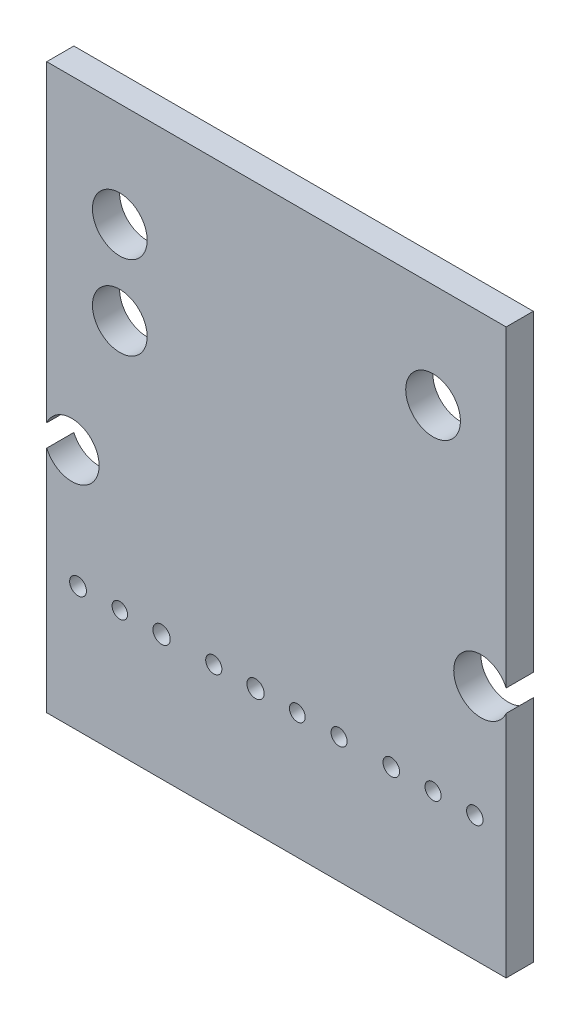
ISO-10303-21;
HEADER;
FILE_DESCRIPTION(('STEP AP214'),'2;1');
FILE_NAME('part.step','',(''),(''),'','','');
FILE_SCHEMA(('AUTOMOTIVE_DESIGN { 1 0 10303 214 1 1 1 1 }'));
ENDSEC;
DATA;
#1=APPLICATION_CONTEXT('core data for automotive mechanical design processes');
#2=APPLICATION_PROTOCOL_DEFINITION('international standard','automotive_design',2000,#1);
#3=PRODUCT_CONTEXT('',#1,'mechanical');
#4=PRODUCT('Part','Part','',(#3));
#5=PRODUCT_RELATED_PRODUCT_CATEGORY('part','',(#4));
#6=PRODUCT_DEFINITION_FORMATION('','',#4);
#7=PRODUCT_DEFINITION_CONTEXT('part definition',#1,'design');
#8=PRODUCT_DEFINITION('design','',#6,#7);
#9=PRODUCT_DEFINITION_SHAPE('','',#8);
#10=(LENGTH_UNIT() NAMED_UNIT(*) SI_UNIT(.MILLI.,.METRE.));
#11=(NAMED_UNIT(*) PLANE_ANGLE_UNIT() SI_UNIT($,.RADIAN.));
#12=(NAMED_UNIT(*) SI_UNIT($,.STERADIAN.) SOLID_ANGLE_UNIT());
#13=UNCERTAINTY_MEASURE_WITH_UNIT(LENGTH_MEASURE(1.E-05),#10,'distance_accuracy_value','');
#14=(GEOMETRIC_REPRESENTATION_CONTEXT(3) GLOBAL_UNCERTAINTY_ASSIGNED_CONTEXT((#13)) GLOBAL_UNIT_ASSIGNED_CONTEXT((#10,
#11,#12)) REPRESENTATION_CONTEXT('',''));
#15=CARTESIAN_POINT('',(0.,0.,0.));
#16=DIRECTION('',(0.,0.,1.));
#17=DIRECTION('',(1.,0.,0.));
#18=AXIS2_PLACEMENT_3D('',#15,#16,#17);
#19=CARTESIAN_POINT('',(26.416,14.605,1.651));
#20=DIRECTION('',(0.,0.,1.));
#21=DIRECTION('',(1.,0.,0.));
#22=AXIS2_PLACEMENT_3D('',#19,#20,#21);
#23=PLANE('',#22);
#24=CARTESIAN_POINT('',(23.495,7.62,1.651));
#25=DIRECTION('',(0.,0.,1.));
#26=DIRECTION('',(1.,0.,0.));
#27=AXIS2_PLACEMENT_3D('',#24,#25,#26);
#28=CIRCLE('',#27,0.490154405860465);
#29=CARTESIAN_POINT('',(23.9851544058605,7.62,1.651));
#30=VERTEX_POINT('',#29);
#31=EDGE_CURVE('E241',#30,#30,#28,.T.);
#32=ORIENTED_EDGE('',*,*,#31,.F.);
#33=EDGE_LOOP('',(#32));
#34=FACE_BOUND('',#33,.T.);
#35=CARTESIAN_POINT('',(17.78,7.62,1.651));
#36=DIRECTION('',(0.,0.,1.));
#37=DIRECTION('',(1.,0.,0.));
#38=AXIS2_PLACEMENT_3D('',#35,#36,#37);
#39=CIRCLE('',#38,0.488742188507494);
#40=CARTESIAN_POINT('',(18.2687421885075,7.62,1.651));
#41=VERTEX_POINT('',#40);
#42=EDGE_CURVE('E229',#41,#41,#39,.T.);
#43=ORIENTED_EDGE('',*,*,#42,.F.);
#44=EDGE_LOOP('',(#43));
#45=FACE_BOUND('',#44,.T.);
#46=CARTESIAN_POINT('',(12.7,7.62,1.651));
#47=DIRECTION('',(0.,0.,1.));
#48=DIRECTION('',(1.,0.,0.));
#49=AXIS2_PLACEMENT_3D('',#46,#47,#48);
#50=CIRCLE('',#49,0.523724162190865);
#51=CARTESIAN_POINT('',(13.2237241621909,7.62,1.651));
#52=VERTEX_POINT('',#51);
#53=EDGE_CURVE('E217',#52,#52,#50,.T.);
#54=ORIENTED_EDGE('',*,*,#53,.F.);
#55=EDGE_LOOP('',(#54));
#56=FACE_BOUND('',#55,.T.);
#57=CARTESIAN_POINT('',(6.985,7.62,1.651));
#58=DIRECTION('',(0.,0.,1.));
#59=DIRECTION('',(1.,0.,0.));
#60=AXIS2_PLACEMENT_3D('',#57,#58,#59);
#61=CIRCLE('',#60,0.527304241851897);
#62=CARTESIAN_POINT('',(7.5123042418519,7.62,1.651));
#63=VERTEX_POINT('',#62);
#64=EDGE_CURVE('E205',#63,#63,#61,.T.);
#65=ORIENTED_EDGE('',*,*,#64,.F.);
#66=EDGE_LOOP('',(#65));
#67=FACE_BOUND('',#66,.T.);
#68=CARTESIAN_POINT('',(1.905,7.62,1.651));
#69=DIRECTION('',(0.,0.,1.));
#70=DIRECTION('',(1.,0.,0.));
#71=AXIS2_PLACEMENT_3D('',#68,#69,#70);
#72=CIRCLE('',#71,0.511037546778993);
#73=CARTESIAN_POINT('',(2.41603754677899,7.62,1.651));
#74=VERTEX_POINT('',#73);
#75=EDGE_CURVE('E193',#74,#74,#72,.T.);
#76=ORIENTED_EDGE('',*,*,#75,.F.);
#77=EDGE_LOOP('',(#76));
#78=FACE_BOUND('',#77,.T.);
#79=CARTESIAN_POINT('',(4.445,27.94,1.651));
#80=DIRECTION('',(0.,0.,1.));
#81=DIRECTION('',(1.,0.,0.));
#82=AXIS2_PLACEMENT_3D('',#79,#80,#81);
#83=CIRCLE('',#82,1.6637);
#84=CARTESIAN_POINT('',(2.7813,27.94,1.651));
#85=VERTEX_POINT('',#84);
#86=EDGE_CURVE('E181',#85,#85,#83,.T.);
#87=ORIENTED_EDGE('',*,*,#86,.F.);
#88=EDGE_LOOP('',(#87));
#89=FACE_BOUND('',#88,.T.);
#90=DIRECTION('',(0.,-1.,0.));
#91=VECTOR('',#90,1.);
#92=CARTESIAN_POINT('',(0.,13.9376757235047,1.651));
#93=LINE('',#92,#91);
#94=CARTESIAN_POINT('',(0.,13.9376757235047,1.651));
#95=VERTEX_POINT('',#94);
#96=CARTESIAN_POINT('',(0.,0.,1.651));
#97=VERTEX_POINT('',#96);
#98=EDGE_CURVE('E144',#95,#97,#93,.T.);
#99=ORIENTED_EDGE('',*,*,#98,.T.);
#100=DIRECTION('',(1.,0.,0.));
#101=VECTOR('',#100,1.);
#102=CARTESIAN_POINT('',(0.,0.,1.651));
#103=LINE('',#102,#101);
#104=CARTESIAN_POINT('',(27.94,0.,1.651));
#105=VERTEX_POINT('',#104);
#106=EDGE_CURVE('E92',#97,#105,#103,.T.);
#107=ORIENTED_EDGE('',*,*,#106,.T.);
#108=DIRECTION('',(0.,1.,0.));
#109=VECTOR('',#108,1.);
#110=CARTESIAN_POINT('',(27.94,0.,1.651));
#111=LINE('',#110,#109);
#112=CARTESIAN_POINT('',(27.94,13.9376757235047,1.651));
#113=VERTEX_POINT('',#112);
#114=EDGE_CURVE('E159',#105,#113,#111,.T.);
#115=ORIENTED_EDGE('',*,*,#114,.T.);
#116=CARTESIAN_POINT('',(26.416,14.605,1.651));
#117=DIRECTION('',(0.,0.,-1.));
#118=DIRECTION('',(1.,0.,0.));
#119=AXIS2_PLACEMENT_3D('',#116,#117,#118);
#120=CIRCLE('',#119,1.6637);
#121=CARTESIAN_POINT('',(27.94,15.2723242764953,1.651));
#122=VERTEX_POINT('',#121);
#123=EDGE_CURVE('E172',#113,#122,#120,.T.);
#124=ORIENTED_EDGE('',*,*,#123,.T.);
#125=DIRECTION('',(0.,1.,0.));
#126=VECTOR('',#125,1.);
#127=CARTESIAN_POINT('',(27.94,15.2723242764953,1.651));
#128=LINE('',#127,#126);
#129=CARTESIAN_POINT('',(27.94,34.29,1.651));
#130=VERTEX_POINT('',#129);
#131=EDGE_CURVE('E111',#122,#130,#128,.T.);
#132=ORIENTED_EDGE('',*,*,#131,.T.);
#133=DIRECTION('',(-1.,0.,0.));
#134=VECTOR('',#133,1.);
#135=CARTESIAN_POINT('',(27.94,34.29,1.651));
#136=LINE('',#135,#134);
#137=CARTESIAN_POINT('',(0.,34.29,1.651));
#138=VERTEX_POINT('',#137);
#139=EDGE_CURVE('E105',#130,#138,#136,.T.);
#140=ORIENTED_EDGE('',*,*,#139,.T.);
#141=DIRECTION('',(0.,-1.,0.));
#142=VECTOR('',#141,1.);
#143=CARTESIAN_POINT('',(0.,34.29,1.651));
#144=LINE('',#143,#142);
#145=CARTESIAN_POINT('',(0.,15.2723242764953,1.651));
#146=VERTEX_POINT('',#145);
#147=EDGE_CURVE('E109',#138,#146,#144,.T.);
#148=ORIENTED_EDGE('',*,*,#147,.T.);
#149=CARTESIAN_POINT('',(1.524,14.605,1.651));
#150=DIRECTION('',(0.,0.,-1.));
#151=DIRECTION('',(1.,0.,0.));
#152=AXIS2_PLACEMENT_3D('',#149,#150,#151);
#153=CIRCLE('',#152,1.6637);
#154=EDGE_CURVE('E49',#146,#95,#153,.T.);
#155=ORIENTED_EDGE('',*,*,#154,.T.);
#156=EDGE_LOOP('',(#99,#107,#115,#124,#132,#140,#148,#155));
#157=FACE_BOUND('',#156,.T.);
#158=CARTESIAN_POINT('',(4.445,22.86,1.651));
#159=DIRECTION('',(0.,0.,1.));
#160=DIRECTION('',(1.,0.,0.));
#161=AXIS2_PLACEMENT_3D('',#158,#159,#160);
#162=CIRCLE('',#161,1.6637);
#163=CARTESIAN_POINT('',(2.7813,22.86,1.651));
#164=VERTEX_POINT('',#163);
#165=EDGE_CURVE('E133',#164,#164,#162,.T.);
#166=ORIENTED_EDGE('',*,*,#165,.F.);
#167=EDGE_LOOP('',(#166));
#168=FACE_BOUND('',#167,.T.);
#169=CARTESIAN_POINT('',(23.495,27.94,1.651));
#170=DIRECTION('',(0.,0.,1.));
#171=DIRECTION('',(1.,0.,0.));
#172=AXIS2_PLACEMENT_3D('',#169,#170,#171);
#173=CIRCLE('',#172,1.6637);
#174=CARTESIAN_POINT('',(21.8313,27.94,1.651));
#175=VERTEX_POINT('',#174);
#176=EDGE_CURVE('E187',#175,#175,#173,.T.);
#177=ORIENTED_EDGE('',*,*,#176,.F.);
#178=EDGE_LOOP('',(#177));
#179=FACE_BOUND('',#178,.T.);
#180=CARTESIAN_POINT('',(4.445,7.62,1.651));
#181=DIRECTION('',(0.,0.,1.));
#182=DIRECTION('',(1.,0.,0.));
#183=AXIS2_PLACEMENT_3D('',#180,#181,#182);
#184=CIRCLE('',#183,0.469586324563875);
#185=CARTESIAN_POINT('',(4.91458632456387,7.62,1.651));
#186=VERTEX_POINT('',#185);
#187=EDGE_CURVE('E199',#186,#186,#184,.T.);
#188=ORIENTED_EDGE('',*,*,#187,.F.);
#189=EDGE_LOOP('',(#188));
#190=FACE_BOUND('',#189,.T.);
#191=CARTESIAN_POINT('',(10.16,7.62,1.651));
#192=DIRECTION('',(0.,0.,1.));
#193=DIRECTION('',(1.,0.,0.));
#194=AXIS2_PLACEMENT_3D('',#191,#192,#193);
#195=CIRCLE('',#194,0.492462628783388);
#196=CARTESIAN_POINT('',(10.6524626287834,7.62,1.651));
#197=VERTEX_POINT('',#196);
#198=EDGE_CURVE('E211',#197,#197,#195,.T.);
#199=ORIENTED_EDGE('',*,*,#198,.F.);
#200=EDGE_LOOP('',(#199));
#201=FACE_BOUND('',#200,.T.);
#202=CARTESIAN_POINT('',(15.24,7.62,1.651));
#203=DIRECTION('',(0.,0.,1.));
#204=DIRECTION('',(1.,0.,0.));
#205=AXIS2_PLACEMENT_3D('',#202,#203,#204);
#206=CIRCLE('',#205,0.478944741966559);
#207=CARTESIAN_POINT('',(15.7189447419666,7.62,1.651));
#208=VERTEX_POINT('',#207);
#209=EDGE_CURVE('E223',#208,#208,#206,.T.);
#210=ORIENTED_EDGE('',*,*,#209,.F.);
#211=EDGE_LOOP('',(#210));
#212=FACE_BOUND('',#211,.T.);
#213=CARTESIAN_POINT('',(20.955,7.62,1.651));
#214=DIRECTION('',(0.,0.,1.));
#215=DIRECTION('',(1.,0.,0.));
#216=AXIS2_PLACEMENT_3D('',#213,#214,#215);
#217=CIRCLE('',#216,0.503485145190443);
#218=CARTESIAN_POINT('',(21.4584851451904,7.62,1.651));
#219=VERTEX_POINT('',#218);
#220=EDGE_CURVE('E235',#219,#219,#217,.T.);
#221=ORIENTED_EDGE('',*,*,#220,.F.);
#222=EDGE_LOOP('',(#221));
#223=FACE_BOUND('',#222,.T.);
#224=CARTESIAN_POINT('',(26.035,7.62,1.651));
#225=DIRECTION('',(0.,0.,1.));
#226=DIRECTION('',(1.,0.,0.));
#227=AXIS2_PLACEMENT_3D('',#224,#225,#226);
#228=CIRCLE('',#227,0.499999000000001);
#229=CARTESIAN_POINT('',(26.534999,7.62,1.651));
#230=VERTEX_POINT('',#229);
#231=EDGE_CURVE('E247',#230,#230,#228,.T.);
#232=ORIENTED_EDGE('',*,*,#231,.F.);
#233=EDGE_LOOP('',(#232));
#234=FACE_BOUND('',#233,.T.);
#235=ADVANCED_FACE('F32',(#34,#45,#56,#67,#78,#89,#157,#168,#179,#190,#201,#212,#223,#234),#23,.T.);
#236=CARTESIAN_POINT('',(26.416,14.605,0.));
#237=DIRECTION('',(0.,0.,1.));
#238=DIRECTION('',(1.,0.,0.));
#239=AXIS2_PLACEMENT_3D('',#236,#237,#238);
#240=PLANE('',#239);
#241=DIRECTION('',(0.,-1.,0.));
#242=VECTOR('',#241,1.);
#243=CARTESIAN_POINT('',(0.,13.9376757235047,0.));
#244=LINE('',#243,#242);
#245=CARTESIAN_POINT('',(0.,13.9376757235047,0.));
#246=VERTEX_POINT('',#245);
#247=CARTESIAN_POINT('',(0.,0.,0.));
#248=VERTEX_POINT('',#247);
#249=EDGE_CURVE('E129',#246,#248,#244,.T.);
#250=ORIENTED_EDGE('',*,*,#249,.F.);
#251=CARTESIAN_POINT('',(1.524,14.605,0.));
#252=DIRECTION('',(0.,0.,-1.));
#253=DIRECTION('',(1.,0.,0.));
#254=AXIS2_PLACEMENT_3D('',#251,#252,#253);
#255=CIRCLE('',#254,1.6637);
#256=CARTESIAN_POINT('',(0.,15.2723242764953,0.));
#257=VERTEX_POINT('',#256);
#258=EDGE_CURVE('E84',#257,#246,#255,.T.);
#259=ORIENTED_EDGE('',*,*,#258,.F.);
#260=DIRECTION('',(0.,-1.,0.));
#261=VECTOR('',#260,1.);
#262=CARTESIAN_POINT('',(0.,34.29,0.));
#263=LINE('',#262,#261);
#264=CARTESIAN_POINT('',(0.,34.29,0.));
#265=VERTEX_POINT('',#264);
#266=EDGE_CURVE('E78',#265,#257,#263,.T.);
#267=ORIENTED_EDGE('',*,*,#266,.F.);
#268=DIRECTION('',(-1.,0.,0.));
#269=VECTOR('',#268,1.);
#270=CARTESIAN_POINT('',(27.94,34.29,0.));
#271=LINE('',#270,#269);
#272=CARTESIAN_POINT('',(27.94,34.29,0.));
#273=VERTEX_POINT('',#272);
#274=EDGE_CURVE('E119',#273,#265,#271,.T.);
#275=ORIENTED_EDGE('',*,*,#274,.F.);
#276=DIRECTION('',(0.,1.,0.));
#277=VECTOR('',#276,1.);
#278=CARTESIAN_POINT('',(27.94,15.2723242764953,0.));
#279=LINE('',#278,#277);
#280=CARTESIAN_POINT('',(27.94,15.2723242764953,0.));
#281=VERTEX_POINT('',#280);
#282=EDGE_CURVE('E139',#281,#273,#279,.T.);
#283=ORIENTED_EDGE('',*,*,#282,.F.);
#284=CARTESIAN_POINT('',(26.416,14.605,0.));
#285=DIRECTION('',(0.,0.,-1.));
#286=DIRECTION('',(1.,0.,0.));
#287=AXIS2_PLACEMENT_3D('',#284,#285,#286);
#288=CIRCLE('',#287,1.6637);
#289=CARTESIAN_POINT('',(27.94,13.9376757235047,0.));
#290=VERTEX_POINT('',#289);
#291=EDGE_CURVE('E137',#290,#281,#288,.T.);
#292=ORIENTED_EDGE('',*,*,#291,.F.);
#293=DIRECTION('',(0.,1.,0.));
#294=VECTOR('',#293,1.);
#295=CARTESIAN_POINT('',(27.94,0.,0.));
#296=LINE('',#295,#294);
#297=CARTESIAN_POINT('',(27.94,0.,0.));
#298=VERTEX_POINT('',#297);
#299=EDGE_CURVE('E135',#298,#290,#296,.T.);
#300=ORIENTED_EDGE('',*,*,#299,.F.);
#301=DIRECTION('',(1.,0.,0.));
#302=VECTOR('',#301,1.);
#303=CARTESIAN_POINT('',(0.,0.,0.));
#304=LINE('',#303,#302);
#305=EDGE_CURVE('E132',#248,#298,#304,.T.);
#306=ORIENTED_EDGE('',*,*,#305,.F.);
#307=EDGE_LOOP('',(#250,#259,#267,#275,#283,#292,#300,#306));
#308=FACE_BOUND('',#307,.T.);
#309=CARTESIAN_POINT('',(4.445,22.86,0.));
#310=DIRECTION('',(0.,0.,1.));
#311=DIRECTION('',(1.,0.,0.));
#312=AXIS2_PLACEMENT_3D('',#309,#310,#311);
#313=CIRCLE('',#312,1.6637);
#314=CARTESIAN_POINT('',(2.7813,22.86,0.));
#315=VERTEX_POINT('',#314);
#316=EDGE_CURVE('E178',#315,#315,#313,.T.);
#317=ORIENTED_EDGE('',*,*,#316,.T.);
#318=EDGE_LOOP('',(#317));
#319=FACE_BOUND('',#318,.T.);
#320=CARTESIAN_POINT('',(4.445,27.94,0.));
#321=DIRECTION('',(0.,0.,1.));
#322=DIRECTION('',(1.,0.,0.));
#323=AXIS2_PLACEMENT_3D('',#320,#321,#322);
#324=CIRCLE('',#323,1.6637);
#325=CARTESIAN_POINT('',(2.7813,27.94,0.));
#326=VERTEX_POINT('',#325);
#327=EDGE_CURVE('E184',#326,#326,#324,.T.);
#328=ORIENTED_EDGE('',*,*,#327,.T.);
#329=EDGE_LOOP('',(#328));
#330=FACE_BOUND('',#329,.T.);
#331=CARTESIAN_POINT('',(23.495,27.94,0.));
#332=DIRECTION('',(0.,0.,1.));
#333=DIRECTION('',(1.,0.,0.));
#334=AXIS2_PLACEMENT_3D('',#331,#332,#333);
#335=CIRCLE('',#334,1.6637);
#336=CARTESIAN_POINT('',(21.8313,27.94,0.));
#337=VERTEX_POINT('',#336);
#338=EDGE_CURVE('E190',#337,#337,#335,.T.);
#339=ORIENTED_EDGE('',*,*,#338,.T.);
#340=EDGE_LOOP('',(#339));
#341=FACE_BOUND('',#340,.T.);
#342=CARTESIAN_POINT('',(1.905,7.62,0.));
#343=DIRECTION('',(0.,0.,1.));
#344=DIRECTION('',(1.,0.,0.));
#345=AXIS2_PLACEMENT_3D('',#342,#343,#344);
#346=CIRCLE('',#345,0.511037546778993);
#347=CARTESIAN_POINT('',(2.41603754677899,7.62,0.));
#348=VERTEX_POINT('',#347);
#349=EDGE_CURVE('E196',#348,#348,#346,.T.);
#350=ORIENTED_EDGE('',*,*,#349,.T.);
#351=EDGE_LOOP('',(#350));
#352=FACE_BOUND('',#351,.T.);
#353=CARTESIAN_POINT('',(4.445,7.62,0.));
#354=DIRECTION('',(0.,0.,1.));
#355=DIRECTION('',(1.,0.,0.));
#356=AXIS2_PLACEMENT_3D('',#353,#354,#355);
#357=CIRCLE('',#356,0.469586324563875);
#358=CARTESIAN_POINT('',(4.91458632456387,7.62,0.));
#359=VERTEX_POINT('',#358);
#360=EDGE_CURVE('E202',#359,#359,#357,.T.);
#361=ORIENTED_EDGE('',*,*,#360,.T.);
#362=EDGE_LOOP('',(#361));
#363=FACE_BOUND('',#362,.T.);
#364=CARTESIAN_POINT('',(6.985,7.62,0.));
#365=DIRECTION('',(0.,0.,1.));
#366=DIRECTION('',(1.,0.,0.));
#367=AXIS2_PLACEMENT_3D('',#364,#365,#366);
#368=CIRCLE('',#367,0.527304241851897);
#369=CARTESIAN_POINT('',(7.5123042418519,7.62,0.));
#370=VERTEX_POINT('',#369);
#371=EDGE_CURVE('E208',#370,#370,#368,.T.);
#372=ORIENTED_EDGE('',*,*,#371,.T.);
#373=EDGE_LOOP('',(#372));
#374=FACE_BOUND('',#373,.T.);
#375=CARTESIAN_POINT('',(10.16,7.62,0.));
#376=DIRECTION('',(0.,0.,1.));
#377=DIRECTION('',(1.,0.,0.));
#378=AXIS2_PLACEMENT_3D('',#375,#376,#377);
#379=CIRCLE('',#378,0.492462628783388);
#380=CARTESIAN_POINT('',(10.6524626287834,7.62,0.));
#381=VERTEX_POINT('',#380);
#382=EDGE_CURVE('E214',#381,#381,#379,.T.);
#383=ORIENTED_EDGE('',*,*,#382,.T.);
#384=EDGE_LOOP('',(#383));
#385=FACE_BOUND('',#384,.T.);
#386=CARTESIAN_POINT('',(12.7,7.62,0.));
#387=DIRECTION('',(0.,0.,1.));
#388=DIRECTION('',(1.,0.,0.));
#389=AXIS2_PLACEMENT_3D('',#386,#387,#388);
#390=CIRCLE('',#389,0.523724162190865);
#391=CARTESIAN_POINT('',(13.2237241621909,7.62,0.));
#392=VERTEX_POINT('',#391);
#393=EDGE_CURVE('E220',#392,#392,#390,.T.);
#394=ORIENTED_EDGE('',*,*,#393,.T.);
#395=EDGE_LOOP('',(#394));
#396=FACE_BOUND('',#395,.T.);
#397=CARTESIAN_POINT('',(15.24,7.62,0.));
#398=DIRECTION('',(0.,0.,1.));
#399=DIRECTION('',(1.,0.,0.));
#400=AXIS2_PLACEMENT_3D('',#397,#398,#399);
#401=CIRCLE('',#400,0.478944741966559);
#402=CARTESIAN_POINT('',(15.7189447419666,7.62,0.));
#403=VERTEX_POINT('',#402);
#404=EDGE_CURVE('E226',#403,#403,#401,.T.);
#405=ORIENTED_EDGE('',*,*,#404,.T.);
#406=EDGE_LOOP('',(#405));
#407=FACE_BOUND('',#406,.T.);
#408=CARTESIAN_POINT('',(17.78,7.62,0.));
#409=DIRECTION('',(0.,0.,1.));
#410=DIRECTION('',(1.,0.,0.));
#411=AXIS2_PLACEMENT_3D('',#408,#409,#410);
#412=CIRCLE('',#411,0.488742188507494);
#413=CARTESIAN_POINT('',(18.2687421885075,7.62,0.));
#414=VERTEX_POINT('',#413);
#415=EDGE_CURVE('E232',#414,#414,#412,.T.);
#416=ORIENTED_EDGE('',*,*,#415,.T.);
#417=EDGE_LOOP('',(#416));
#418=FACE_BOUND('',#417,.T.);
#419=CARTESIAN_POINT('',(20.955,7.62,0.));
#420=DIRECTION('',(0.,0.,1.));
#421=DIRECTION('',(1.,0.,0.));
#422=AXIS2_PLACEMENT_3D('',#419,#420,#421);
#423=CIRCLE('',#422,0.503485145190443);
#424=CARTESIAN_POINT('',(21.4584851451904,7.62,0.));
#425=VERTEX_POINT('',#424);
#426=EDGE_CURVE('E238',#425,#425,#423,.T.);
#427=ORIENTED_EDGE('',*,*,#426,.T.);
#428=EDGE_LOOP('',(#427));
#429=FACE_BOUND('',#428,.T.);
#430=CARTESIAN_POINT('',(23.495,7.62,0.));
#431=DIRECTION('',(0.,0.,1.));
#432=DIRECTION('',(1.,0.,0.));
#433=AXIS2_PLACEMENT_3D('',#430,#431,#432);
#434=CIRCLE('',#433,0.490154405860465);
#435=CARTESIAN_POINT('',(23.9851544058605,7.62,0.));
#436=VERTEX_POINT('',#435);
#437=EDGE_CURVE('E244',#436,#436,#434,.T.);
#438=ORIENTED_EDGE('',*,*,#437,.T.);
#439=EDGE_LOOP('',(#438));
#440=FACE_BOUND('',#439,.T.);
#441=CARTESIAN_POINT('',(26.035,7.62,0.));
#442=DIRECTION('',(0.,0.,1.));
#443=DIRECTION('',(1.,0.,0.));
#444=AXIS2_PLACEMENT_3D('',#441,#442,#443);
#445=CIRCLE('',#444,0.499999000000001);
#446=CARTESIAN_POINT('',(26.534999,7.62,0.));
#447=VERTEX_POINT('',#446);
#448=EDGE_CURVE('E250',#447,#447,#445,.T.);
#449=ORIENTED_EDGE('',*,*,#448,.T.);
#450=EDGE_LOOP('',(#449));
#451=FACE_BOUND('',#450,.T.);
#452=ADVANCED_FACE('F163',(#308,#319,#330,#341,#352,#363,#374,#385,#396,#407,#418,#429,#440,
#451),#240,.F.);
#453=CARTESIAN_POINT('',(0.,13.9376757235047,1.651));
#454=DIRECTION('',(1.,0.,0.));
#455=DIRECTION('',(0.,0.,-1.));
#456=AXIS2_PLACEMENT_3D('',#453,#454,#455);
#457=PLANE('',#456);
#458=ORIENTED_EDGE('',*,*,#249,.T.);
#459=DIRECTION('',(0.,0.,-1.));
#460=VECTOR('',#459,1.);
#461=CARTESIAN_POINT('',(0.,0.,1.651));
#462=LINE('',#461,#460);
#463=EDGE_CURVE('E11',#97,#248,#462,.T.);
#464=ORIENTED_EDGE('',*,*,#463,.F.);
#465=ORIENTED_EDGE('',*,*,#98,.F.);
#466=DIRECTION('',(0.,0.,-1.));
#467=VECTOR('',#466,1.);
#468=CARTESIAN_POINT('',(0.,13.9376757235047,1.651));
#469=LINE('',#468,#467);
#470=EDGE_CURVE('E125',#95,#246,#469,.T.);
#471=ORIENTED_EDGE('',*,*,#470,.T.);
#472=EDGE_LOOP('',(#458,#464,#465,#471));
#473=FACE_BOUND('',#472,.T.);
#474=ADVANCED_FACE('F34',(#473),#457,.F.);
#475=CARTESIAN_POINT('',(0.,0.,1.651));
#476=DIRECTION('',(0.,1.,0.));
#477=DIRECTION('',(-1.,0.,0.));
#478=AXIS2_PLACEMENT_3D('',#475,#476,#477);
#479=PLANE('',#478);
#480=ORIENTED_EDGE('',*,*,#305,.T.);
#481=DIRECTION('',(0.,0.,-1.));
#482=VECTOR('',#481,1.);
#483=CARTESIAN_POINT('',(27.94,0.,1.651));
#484=LINE('',#483,#482);
#485=EDGE_CURVE('E41',#105,#298,#484,.T.);
#486=ORIENTED_EDGE('',*,*,#485,.F.);
#487=ORIENTED_EDGE('',*,*,#106,.F.);
#488=ORIENTED_EDGE('',*,*,#463,.T.);
#489=EDGE_LOOP('',(#480,#486,#487,#488));
#490=FACE_BOUND('',#489,.T.);
#491=ADVANCED_FACE('F284',(#490),#479,.F.);
#492=CARTESIAN_POINT('',(27.94,0.,1.651));
#493=DIRECTION('',(-1.,0.,0.));
#494=DIRECTION('',(0.,0.,1.));
#495=AXIS2_PLACEMENT_3D('',#492,#493,#494);
#496=PLANE('',#495);
#497=ORIENTED_EDGE('',*,*,#299,.T.);
#498=DIRECTION('',(0.,0.,-1.));
#499=VECTOR('',#498,1.);
#500=CARTESIAN_POINT('',(27.94,13.9376757235047,1.651));
#501=LINE('',#500,#499);
#502=EDGE_CURVE('E151',#113,#290,#501,.T.);
#503=ORIENTED_EDGE('',*,*,#502,.F.);
#504=ORIENTED_EDGE('',*,*,#114,.F.);
#505=ORIENTED_EDGE('',*,*,#485,.T.);
#506=EDGE_LOOP('',(#497,#503,#504,#505));
#507=FACE_BOUND('',#506,.T.);
#508=ADVANCED_FACE('F157',(#507),#496,.F.);
#509=CARTESIAN_POINT('',(26.416,14.605,1.651));
#510=DIRECTION('',(0.,0.,-1.));
#511=DIRECTION('',(-1.,0.,0.));
#512=AXIS2_PLACEMENT_3D('',#509,#510,#511);
#513=CYLINDRICAL_SURFACE('',#512,1.6637);
#514=ORIENTED_EDGE('',*,*,#291,.T.);
#515=DIRECTION('',(0.,0.,-1.));
#516=VECTOR('',#515,1.);
#517=CARTESIAN_POINT('',(27.94,15.2723242764953,1.651));
#518=LINE('',#517,#516);
#519=EDGE_CURVE('E148',#122,#281,#518,.T.);
#520=ORIENTED_EDGE('',*,*,#519,.F.);
#521=ORIENTED_EDGE('',*,*,#123,.F.);
#522=ORIENTED_EDGE('',*,*,#502,.T.);
#523=EDGE_LOOP('',(#514,#520,#521,#522));
#524=FACE_BOUND('',#523,.T.);
#525=ADVANCED_FACE('F168',(#524),#513,.F.);
#526=CARTESIAN_POINT('',(27.94,15.2723242764953,1.651));
#527=DIRECTION('',(-1.,0.,0.));
#528=DIRECTION('',(0.,0.,1.));
#529=AXIS2_PLACEMENT_3D('',#526,#527,#528);
#530=PLANE('',#529);
#531=ORIENTED_EDGE('',*,*,#282,.T.);
#532=DIRECTION('',(0.,0.,-1.));
#533=VECTOR('',#532,1.);
#534=CARTESIAN_POINT('',(27.94,34.29,1.651));
#535=LINE('',#534,#533);
#536=EDGE_CURVE('E120',#130,#273,#535,.T.);
#537=ORIENTED_EDGE('',*,*,#536,.F.);
#538=ORIENTED_EDGE('',*,*,#131,.F.);
#539=ORIENTED_EDGE('',*,*,#519,.T.);
#540=EDGE_LOOP('',(#531,#537,#538,#539));
#541=FACE_BOUND('',#540,.T.);
#542=ADVANCED_FACE('F171',(#541),#530,.F.);
#543=CARTESIAN_POINT('',(27.94,34.29,1.651));
#544=DIRECTION('',(0.,-1.,0.));
#545=DIRECTION('',(0.,0.,-1.));
#546=AXIS2_PLACEMENT_3D('',#543,#544,#545);
#547=PLANE('',#546);
#548=ORIENTED_EDGE('',*,*,#274,.T.);
#549=DIRECTION('',(0.,0.,-1.));
#550=VECTOR('',#549,1.);
#551=CARTESIAN_POINT('',(0.,34.29,1.651));
#552=LINE('',#551,#550);
#553=EDGE_CURVE('E116',#138,#265,#552,.T.);
#554=ORIENTED_EDGE('',*,*,#553,.F.);
#555=ORIENTED_EDGE('',*,*,#139,.F.);
#556=ORIENTED_EDGE('',*,*,#536,.T.);
#557=EDGE_LOOP('',(#548,#554,#555,#556));
#558=FACE_BOUND('',#557,.T.);
#559=ADVANCED_FACE('F117',(#558),#547,.F.);
#560=CARTESIAN_POINT('',(0.,34.29,1.651));
#561=DIRECTION('',(1.,0.,0.));
#562=DIRECTION('',(0.,0.,-1.));
#563=AXIS2_PLACEMENT_3D('',#560,#561,#562);
#564=PLANE('',#563);
#565=ORIENTED_EDGE('',*,*,#266,.T.);
#566=DIRECTION('',(0.,0.,-1.));
#567=VECTOR('',#566,1.);
#568=CARTESIAN_POINT('',(0.,15.2723242764953,1.651));
#569=LINE('',#568,#567);
#570=EDGE_CURVE('E121',#146,#257,#569,.T.);
#571=ORIENTED_EDGE('',*,*,#570,.F.);
#572=ORIENTED_EDGE('',*,*,#147,.F.);
#573=ORIENTED_EDGE('',*,*,#553,.T.);
#574=EDGE_LOOP('',(#565,#571,#572,#573));
#575=FACE_BOUND('',#574,.T.);
#576=ADVANCED_FACE('F123',(#575),#564,.F.);
#577=CARTESIAN_POINT('',(1.524,14.605,1.651));
#578=DIRECTION('',(0.,0.,-1.));
#579=DIRECTION('',(-1.,0.,0.));
#580=AXIS2_PLACEMENT_3D('',#577,#578,#579);
#581=CYLINDRICAL_SURFACE('',#580,1.6637);
#582=ORIENTED_EDGE('',*,*,#258,.T.);
#583=ORIENTED_EDGE('',*,*,#470,.F.);
#584=ORIENTED_EDGE('',*,*,#154,.F.);
#585=ORIENTED_EDGE('',*,*,#570,.T.);
#586=EDGE_LOOP('',(#582,#583,#584,#585));
#587=FACE_BOUND('',#586,.T.);
#588=ADVANCED_FACE('F272',(#587),#581,.F.);
#589=CARTESIAN_POINT('',(4.445,22.86,1.651));
#590=DIRECTION('',(0.,0.,-1.));
#591=DIRECTION('',(-1.,0.,0.));
#592=AXIS2_PLACEMENT_3D('',#589,#590,#591);
#593=CYLINDRICAL_SURFACE('',#592,1.6637);
#594=CARTESIAN_POINT('',(2.7813,22.86,1.651));
#595=CARTESIAN_POINT('',(2.7813,22.86,1.63380208333333));
#596=CARTESIAN_POINT('',(2.7813,22.86,1.61660416666667));
#597=CARTESIAN_POINT('',(2.7813,22.86,1.58220833333333));
#598=CARTESIAN_POINT('',(2.7813,22.86,1.56501041666667));
#599=CARTESIAN_POINT('',(2.7813,22.86,1.53061458333333));
#600=CARTESIAN_POINT('',(2.7813,22.86,1.51341666666667));
#601=CARTESIAN_POINT('',(2.7813,22.86,1.47902083333333));
#602=CARTESIAN_POINT('',(2.7813,22.86,1.46182291666667));
#603=CARTESIAN_POINT('',(2.7813,22.86,1.42742708333333));
#604=CARTESIAN_POINT('',(2.7813,22.86,1.41022916666667));
#605=CARTESIAN_POINT('',(2.7813,22.86,1.37583333333333));
#606=CARTESIAN_POINT('',(2.7813,22.86,1.35863541666667));
#607=CARTESIAN_POINT('',(2.7813,22.86,1.32423958333333));
#608=CARTESIAN_POINT('',(2.7813,22.86,1.30704166666667));
#609=CARTESIAN_POINT('',(2.7813,22.86,1.27264583333333));
#610=CARTESIAN_POINT('',(2.7813,22.86,1.25544791666667));
#611=CARTESIAN_POINT('',(2.7813,22.86,1.22105208333333));
#612=CARTESIAN_POINT('',(2.7813,22.86,1.20385416666667));
#613=CARTESIAN_POINT('',(2.7813,22.86,1.16945833333333));
#614=CARTESIAN_POINT('',(2.7813,22.86,1.15226041666667));
#615=CARTESIAN_POINT('',(2.7813,22.86,1.11786458333333));
#616=CARTESIAN_POINT('',(2.7813,22.86,1.10066666666667));
#617=CARTESIAN_POINT('',(2.7813,22.86,1.06627083333333));
#618=CARTESIAN_POINT('',(2.7813,22.86,1.04907291666667));
#619=CARTESIAN_POINT('',(2.7813,22.86,1.01467708333333));
#620=CARTESIAN_POINT('',(2.7813,22.86,0.997479166666666));
#621=CARTESIAN_POINT('',(2.7813,22.86,0.963083333333333));
#622=CARTESIAN_POINT('',(2.7813,22.86,0.945885416666666));
#623=CARTESIAN_POINT('',(2.7813,22.86,0.911489583333333));
#624=CARTESIAN_POINT('',(2.7813,22.86,0.894291666666666));
#625=CARTESIAN_POINT('',(2.7813,22.86,0.859895833333333));
#626=CARTESIAN_POINT('',(2.7813,22.86,0.842697916666666));
#627=CARTESIAN_POINT('',(2.7813,22.86,0.808302083333333));
#628=CARTESIAN_POINT('',(2.7813,22.86,0.791104166666666));
#629=CARTESIAN_POINT('',(2.7813,22.86,0.756708333333333));
#630=CARTESIAN_POINT('',(2.7813,22.86,0.739510416666667));
#631=CARTESIAN_POINT('',(2.7813,22.86,0.705114583333333));
#632=CARTESIAN_POINT('',(2.7813,22.86,0.687916666666667));
#633=CARTESIAN_POINT('',(2.7813,22.86,0.653520833333333));
#634=CARTESIAN_POINT('',(2.7813,22.86,0.636322916666667));
#635=CARTESIAN_POINT('',(2.7813,22.86,0.601927083333333));
#636=CARTESIAN_POINT('',(2.7813,22.86,0.584729166666667));
#637=CARTESIAN_POINT('',(2.7813,22.86,0.550333333333333));
#638=CARTESIAN_POINT('',(2.7813,22.86,0.533135416666667));
#639=CARTESIAN_POINT('',(2.7813,22.86,0.498739583333333));
#640=CARTESIAN_POINT('',(2.7813,22.86,0.481541666666667));
#641=CARTESIAN_POINT('',(2.7813,22.86,0.447145833333333));
#642=CARTESIAN_POINT('',(2.7813,22.86,0.429947916666667));
#643=CARTESIAN_POINT('',(2.7813,22.86,0.395552083333333));
#644=CARTESIAN_POINT('',(2.7813,22.86,0.378354166666667));
#645=CARTESIAN_POINT('',(2.7813,22.86,0.343958333333333));
#646=CARTESIAN_POINT('',(2.7813,22.86,0.326760416666667));
#647=CARTESIAN_POINT('',(2.7813,22.86,0.292364583333333));
#648=CARTESIAN_POINT('',(2.7813,22.86,0.275166666666667));
#649=CARTESIAN_POINT('',(2.7813,22.86,0.240770833333333));
#650=CARTESIAN_POINT('',(2.7813,22.86,0.223572916666667));
#651=CARTESIAN_POINT('',(2.7813,22.86,0.189177083333333));
#652=CARTESIAN_POINT('',(2.7813,22.86,0.171979166666667));
#653=CARTESIAN_POINT('',(2.7813,22.86,0.137583333333333));
#654=CARTESIAN_POINT('',(2.7813,22.86,0.120385416666667));
#655=CARTESIAN_POINT('',(2.7813,22.86,0.0859895833333333));
#656=CARTESIAN_POINT('',(2.7813,22.86,0.0687916666666667));
#657=CARTESIAN_POINT('',(2.7813,22.86,0.0343958333333333));
#658=CARTESIAN_POINT('',(2.7813,22.86,0.0171979166666666));
#659=CARTESIAN_POINT('',(2.7813,22.86,0.));
#660=B_SPLINE_CURVE_WITH_KNOTS('',3,(#594,#595,#596,#597,#598,#599,#600,#601,#602,#603,#604,
#605,#606,#607,#608,#609,#610,#611,#612,#613,#614,#615,#616,#617,#618,#619,#620,#621,#622,#623,
#624,#625,#626,#627,#628,#629,#630,#631,#632,#633,#634,#635,#636,#637,#638,#639,#640,#641,#642,
#643,#644,#645,#646,#647,#648,#649,#650,#651,#652,#653,#654,#655,#656,#657,#658,#659),
.UNSPECIFIED.,.F.,.F.,(4,2,2,2,2,2,2,2,2,2,2,2,2,2,2,2,2,2,2,2,2,2,2,2,2,2,2,2,2,2,2,2,4),(0.,
0.0515937500000002,0.1031875,0.15478125,0.206375,0.25796875,0.3095625,0.36115625,0.41275,
0.46434375,0.5159375,0.56753125,0.619125,0.67071875,0.7223125,0.77390625,0.8255,0.87709375,
0.9286875,0.98028125,1.031875,1.08346875,1.1350625,1.18665625,1.23825,1.28984375,1.3414375,
1.39303125,1.444625,1.49621875,1.5478125,1.59940625,1.651),.UNSPECIFIED.);
#661=EDGE_CURVE('BSEAM269',#164,#315,#660,.T.);
#662=ORIENTED_EDGE('',*,*,#165,.T.);
#663=ORIENTED_EDGE('',*,*,#316,.F.);
#664=ORIENTED_EDGE('',*,*,#661,.T.);
#665=ORIENTED_EDGE('',*,*,#661,.F.);
#666=EDGE_LOOP('',(#662,#664,#663,#665));
#667=FACE_BOUND('',#666,.T.);
#668=ADVANCED_FACE('F269',(#667),#593,.F.);
#669=CARTESIAN_POINT('',(4.445,27.94,1.651));
#670=DIRECTION('',(0.,0.,-1.));
#671=DIRECTION('',(-1.,0.,0.));
#672=AXIS2_PLACEMENT_3D('',#669,#670,#671);
#673=CYLINDRICAL_SURFACE('',#672,1.6637);
#674=CARTESIAN_POINT('',(2.7813,27.94,1.651));
#675=CARTESIAN_POINT('',(2.7813,27.94,1.63380208333333));
#676=CARTESIAN_POINT('',(2.7813,27.94,1.61660416666667));
#677=CARTESIAN_POINT('',(2.7813,27.94,1.58220833333333));
#678=CARTESIAN_POINT('',(2.7813,27.94,1.56501041666667));
#679=CARTESIAN_POINT('',(2.7813,27.94,1.53061458333333));
#680=CARTESIAN_POINT('',(2.7813,27.94,1.51341666666667));
#681=CARTESIAN_POINT('',(2.7813,27.94,1.47902083333333));
#682=CARTESIAN_POINT('',(2.7813,27.94,1.46182291666667));
#683=CARTESIAN_POINT('',(2.7813,27.94,1.42742708333333));
#684=CARTESIAN_POINT('',(2.7813,27.94,1.41022916666667));
#685=CARTESIAN_POINT('',(2.7813,27.94,1.37583333333333));
#686=CARTESIAN_POINT('',(2.7813,27.94,1.35863541666667));
#687=CARTESIAN_POINT('',(2.7813,27.94,1.32423958333333));
#688=CARTESIAN_POINT('',(2.7813,27.94,1.30704166666667));
#689=CARTESIAN_POINT('',(2.7813,27.94,1.27264583333333));
#690=CARTESIAN_POINT('',(2.7813,27.94,1.25544791666667));
#691=CARTESIAN_POINT('',(2.7813,27.94,1.22105208333333));
#692=CARTESIAN_POINT('',(2.7813,27.94,1.20385416666667));
#693=CARTESIAN_POINT('',(2.7813,27.94,1.16945833333333));
#694=CARTESIAN_POINT('',(2.7813,27.94,1.15226041666667));
#695=CARTESIAN_POINT('',(2.7813,27.94,1.11786458333333));
#696=CARTESIAN_POINT('',(2.7813,27.94,1.10066666666667));
#697=CARTESIAN_POINT('',(2.7813,27.94,1.06627083333333));
#698=CARTESIAN_POINT('',(2.7813,27.94,1.04907291666667));
#699=CARTESIAN_POINT('',(2.7813,27.94,1.01467708333333));
#700=CARTESIAN_POINT('',(2.7813,27.94,0.997479166666666));
#701=CARTESIAN_POINT('',(2.7813,27.94,0.963083333333333));
#702=CARTESIAN_POINT('',(2.7813,27.94,0.945885416666666));
#703=CARTESIAN_POINT('',(2.7813,27.94,0.911489583333333));
#704=CARTESIAN_POINT('',(2.7813,27.94,0.894291666666666));
#705=CARTESIAN_POINT('',(2.7813,27.94,0.859895833333333));
#706=CARTESIAN_POINT('',(2.7813,27.94,0.842697916666666));
#707=CARTESIAN_POINT('',(2.7813,27.94,0.808302083333333));
#708=CARTESIAN_POINT('',(2.7813,27.94,0.791104166666666));
#709=CARTESIAN_POINT('',(2.7813,27.94,0.756708333333333));
#710=CARTESIAN_POINT('',(2.7813,27.94,0.739510416666667));
#711=CARTESIAN_POINT('',(2.7813,27.94,0.705114583333333));
#712=CARTESIAN_POINT('',(2.7813,27.94,0.687916666666667));
#713=CARTESIAN_POINT('',(2.7813,27.94,0.653520833333333));
#714=CARTESIAN_POINT('',(2.7813,27.94,0.636322916666667));
#715=CARTESIAN_POINT('',(2.7813,27.94,0.601927083333333));
#716=CARTESIAN_POINT('',(2.7813,27.94,0.584729166666667));
#717=CARTESIAN_POINT('',(2.7813,27.94,0.550333333333333));
#718=CARTESIAN_POINT('',(2.7813,27.94,0.533135416666667));
#719=CARTESIAN_POINT('',(2.7813,27.94,0.498739583333333));
#720=CARTESIAN_POINT('',(2.7813,27.94,0.481541666666667));
#721=CARTESIAN_POINT('',(2.7813,27.94,0.447145833333333));
#722=CARTESIAN_POINT('',(2.7813,27.94,0.429947916666667));
#723=CARTESIAN_POINT('',(2.7813,27.94,0.395552083333333));
#724=CARTESIAN_POINT('',(2.7813,27.94,0.378354166666667));
#725=CARTESIAN_POINT('',(2.7813,27.94,0.343958333333333));
#726=CARTESIAN_POINT('',(2.7813,27.94,0.326760416666667));
#727=CARTESIAN_POINT('',(2.7813,27.94,0.292364583333333));
#728=CARTESIAN_POINT('',(2.7813,27.94,0.275166666666667));
#729=CARTESIAN_POINT('',(2.7813,27.94,0.240770833333333));
#730=CARTESIAN_POINT('',(2.7813,27.94,0.223572916666667));
#731=CARTESIAN_POINT('',(2.7813,27.94,0.189177083333333));
#732=CARTESIAN_POINT('',(2.7813,27.94,0.171979166666667));
#733=CARTESIAN_POINT('',(2.7813,27.94,0.137583333333333));
#734=CARTESIAN_POINT('',(2.7813,27.94,0.120385416666667));
#735=CARTESIAN_POINT('',(2.7813,27.94,0.0859895833333333));
#736=CARTESIAN_POINT('',(2.7813,27.94,0.0687916666666667));
#737=CARTESIAN_POINT('',(2.7813,27.94,0.0343958333333333));
#738=CARTESIAN_POINT('',(2.7813,27.94,0.0171979166666666));
#739=CARTESIAN_POINT('',(2.7813,27.94,0.));
#740=B_SPLINE_CURVE_WITH_KNOTS('',3,(#674,#675,#676,#677,#678,#679,#680,#681,#682,#683,#684,
#685,#686,#687,#688,#689,#690,#691,#692,#693,#694,#695,#696,#697,#698,#699,#700,#701,#702,#703,
#704,#705,#706,#707,#708,#709,#710,#711,#712,#713,#714,#715,#716,#717,#718,#719,#720,#721,#722,
#723,#724,#725,#726,#727,#728,#729,#730,#731,#732,#733,#734,#735,#736,#737,#738,#739),
.UNSPECIFIED.,.F.,.F.,(4,2,2,2,2,2,2,2,2,2,2,2,2,2,2,2,2,2,2,2,2,2,2,2,2,2,2,2,2,2,2,2,4),(0.,
0.0515937500000002,0.1031875,0.15478125,0.206375,0.25796875,0.3095625,0.36115625,0.41275,
0.46434375,0.5159375,0.56753125,0.619125,0.67071875,0.7223125,0.77390625,0.8255,0.87709375,
0.9286875,0.98028125,1.031875,1.08346875,1.1350625,1.18665625,1.23825,1.28984375,1.3414375,
1.39303125,1.444625,1.49621875,1.5478125,1.59940625,1.651),.UNSPECIFIED.);
#741=EDGE_CURVE('BSEAM348',#85,#326,#740,.T.);
#742=ORIENTED_EDGE('',*,*,#86,.T.);
#743=ORIENTED_EDGE('',*,*,#327,.F.);
#744=ORIENTED_EDGE('',*,*,#741,.T.);
#745=ORIENTED_EDGE('',*,*,#741,.F.);
#746=EDGE_LOOP('',(#742,#744,#743,#745));
#747=FACE_BOUND('',#746,.T.);
#748=ADVANCED_FACE('F348',(#747),#673,.F.);
#749=CARTESIAN_POINT('',(23.495,27.94,1.651));
#750=DIRECTION('',(0.,0.,-1.));
#751=DIRECTION('',(-1.,0.,0.));
#752=AXIS2_PLACEMENT_3D('',#749,#750,#751);
#753=CYLINDRICAL_SURFACE('',#752,1.6637);
#754=CARTESIAN_POINT('',(21.8313,27.94,1.651));
#755=CARTESIAN_POINT('',(21.8313,27.94,1.63380208333333));
#756=CARTESIAN_POINT('',(21.8313,27.94,1.61660416666667));
#757=CARTESIAN_POINT('',(21.8313,27.94,1.58220833333333));
#758=CARTESIAN_POINT('',(21.8313,27.94,1.56501041666667));
#759=CARTESIAN_POINT('',(21.8313,27.94,1.53061458333333));
#760=CARTESIAN_POINT('',(21.8313,27.94,1.51341666666667));
#761=CARTESIAN_POINT('',(21.8313,27.94,1.47902083333333));
#762=CARTESIAN_POINT('',(21.8313,27.94,1.46182291666667));
#763=CARTESIAN_POINT('',(21.8313,27.94,1.42742708333333));
#764=CARTESIAN_POINT('',(21.8313,27.94,1.41022916666667));
#765=CARTESIAN_POINT('',(21.8313,27.94,1.37583333333333));
#766=CARTESIAN_POINT('',(21.8313,27.94,1.35863541666667));
#767=CARTESIAN_POINT('',(21.8313,27.94,1.32423958333333));
#768=CARTESIAN_POINT('',(21.8313,27.94,1.30704166666667));
#769=CARTESIAN_POINT('',(21.8313,27.94,1.27264583333333));
#770=CARTESIAN_POINT('',(21.8313,27.94,1.25544791666667));
#771=CARTESIAN_POINT('',(21.8313,27.94,1.22105208333333));
#772=CARTESIAN_POINT('',(21.8313,27.94,1.20385416666667));
#773=CARTESIAN_POINT('',(21.8313,27.94,1.16945833333333));
#774=CARTESIAN_POINT('',(21.8313,27.94,1.15226041666667));
#775=CARTESIAN_POINT('',(21.8313,27.94,1.11786458333333));
#776=CARTESIAN_POINT('',(21.8313,27.94,1.10066666666667));
#777=CARTESIAN_POINT('',(21.8313,27.94,1.06627083333333));
#778=CARTESIAN_POINT('',(21.8313,27.94,1.04907291666667));
#779=CARTESIAN_POINT('',(21.8313,27.94,1.01467708333333));
#780=CARTESIAN_POINT('',(21.8313,27.94,0.997479166666666));
#781=CARTESIAN_POINT('',(21.8313,27.94,0.963083333333333));
#782=CARTESIAN_POINT('',(21.8313,27.94,0.945885416666666));
#783=CARTESIAN_POINT('',(21.8313,27.94,0.911489583333333));
#784=CARTESIAN_POINT('',(21.8313,27.94,0.894291666666666));
#785=CARTESIAN_POINT('',(21.8313,27.94,0.859895833333333));
#786=CARTESIAN_POINT('',(21.8313,27.94,0.842697916666666));
#787=CARTESIAN_POINT('',(21.8313,27.94,0.808302083333333));
#788=CARTESIAN_POINT('',(21.8313,27.94,0.791104166666666));
#789=CARTESIAN_POINT('',(21.8313,27.94,0.756708333333333));
#790=CARTESIAN_POINT('',(21.8313,27.94,0.739510416666667));
#791=CARTESIAN_POINT('',(21.8313,27.94,0.705114583333333));
#792=CARTESIAN_POINT('',(21.8313,27.94,0.687916666666667));
#793=CARTESIAN_POINT('',(21.8313,27.94,0.653520833333333));
#794=CARTESIAN_POINT('',(21.8313,27.94,0.636322916666667));
#795=CARTESIAN_POINT('',(21.8313,27.94,0.601927083333333));
#796=CARTESIAN_POINT('',(21.8313,27.94,0.584729166666667));
#797=CARTESIAN_POINT('',(21.8313,27.94,0.550333333333333));
#798=CARTESIAN_POINT('',(21.8313,27.94,0.533135416666667));
#799=CARTESIAN_POINT('',(21.8313,27.94,0.498739583333333));
#800=CARTESIAN_POINT('',(21.8313,27.94,0.481541666666667));
#801=CARTESIAN_POINT('',(21.8313,27.94,0.447145833333333));
#802=CARTESIAN_POINT('',(21.8313,27.94,0.429947916666667));
#803=CARTESIAN_POINT('',(21.8313,27.94,0.395552083333333));
#804=CARTESIAN_POINT('',(21.8313,27.94,0.378354166666667));
#805=CARTESIAN_POINT('',(21.8313,27.94,0.343958333333333));
#806=CARTESIAN_POINT('',(21.8313,27.94,0.326760416666667));
#807=CARTESIAN_POINT('',(21.8313,27.94,0.292364583333333));
#808=CARTESIAN_POINT('',(21.8313,27.94,0.275166666666667));
#809=CARTESIAN_POINT('',(21.8313,27.94,0.240770833333333));
#810=CARTESIAN_POINT('',(21.8313,27.94,0.223572916666667));
#811=CARTESIAN_POINT('',(21.8313,27.94,0.189177083333333));
#812=CARTESIAN_POINT('',(21.8313,27.94,0.171979166666667));
#813=CARTESIAN_POINT('',(21.8313,27.94,0.137583333333333));
#814=CARTESIAN_POINT('',(21.8313,27.94,0.120385416666667));
#815=CARTESIAN_POINT('',(21.8313,27.94,0.0859895833333333));
#816=CARTESIAN_POINT('',(21.8313,27.94,0.0687916666666667));
#817=CARTESIAN_POINT('',(21.8313,27.94,0.0343958333333333));
#818=CARTESIAN_POINT('',(21.8313,27.94,0.0171979166666666));
#819=CARTESIAN_POINT('',(21.8313,27.94,0.));
#820=B_SPLINE_CURVE_WITH_KNOTS('',3,(#754,#755,#756,#757,#758,#759,#760,#761,#762,#763,#764,
#765,#766,#767,#768,#769,#770,#771,#772,#773,#774,#775,#776,#777,#778,#779,#780,#781,#782,#783,
#784,#785,#786,#787,#788,#789,#790,#791,#792,#793,#794,#795,#796,#797,#798,#799,#800,#801,#802,
#803,#804,#805,#806,#807,#808,#809,#810,#811,#812,#813,#814,#815,#816,#817,#818,#819),
.UNSPECIFIED.,.F.,.F.,(4,2,2,2,2,2,2,2,2,2,2,2,2,2,2,2,2,2,2,2,2,2,2,2,2,2,2,2,2,2,2,2,4),(0.,
0.0515937500000002,0.1031875,0.15478125,0.206375,0.25796875,0.3095625,0.36115625,0.41275,
0.46434375,0.5159375,0.56753125,0.619125,0.67071875,0.7223125,0.77390625,0.8255,0.87709375,
0.9286875,0.98028125,1.031875,1.08346875,1.1350625,1.18665625,1.23825,1.28984375,1.3414375,
1.39303125,1.444625,1.49621875,1.5478125,1.59940625,1.651),.UNSPECIFIED.);
#821=EDGE_CURVE('BSEAM356',#175,#337,#820,.T.);
#822=ORIENTED_EDGE('',*,*,#176,.T.);
#823=ORIENTED_EDGE('',*,*,#338,.F.);
#824=ORIENTED_EDGE('',*,*,#821,.T.);
#825=ORIENTED_EDGE('',*,*,#821,.F.);
#826=EDGE_LOOP('',(#822,#824,#823,#825));
#827=FACE_BOUND('',#826,.T.);
#828=ADVANCED_FACE('F356',(#827),#753,.F.);
#829=CARTESIAN_POINT('',(1.905,7.62,1.651));
#830=DIRECTION('',(0.,0.,-1.));
#831=DIRECTION('',(-1.,0.,0.));
#832=AXIS2_PLACEMENT_3D('',#829,#830,#831);
#833=CYLINDRICAL_SURFACE('',#832,0.511037546778993);
#834=ORIENTED_EDGE('',*,*,#75,.T.);
#835=EDGE_LOOP('',(#834));
#836=FACE_BOUND('',#835,.T.);
#837=ORIENTED_EDGE('',*,*,#349,.F.);
#838=EDGE_LOOP('',(#837));
#839=FACE_BOUND('',#838,.T.);
#840=ADVANCED_FACE('F364',(#836,#839),#833,.F.);
#841=CARTESIAN_POINT('',(4.445,7.62,1.651));
#842=DIRECTION('',(0.,0.,-1.));
#843=DIRECTION('',(-1.,0.,0.));
#844=AXIS2_PLACEMENT_3D('',#841,#842,#843);
#845=CYLINDRICAL_SURFACE('',#844,0.469586324563875);
#846=ORIENTED_EDGE('',*,*,#187,.T.);
#847=EDGE_LOOP('',(#846));
#848=FACE_BOUND('',#847,.T.);
#849=ORIENTED_EDGE('',*,*,#360,.F.);
#850=EDGE_LOOP('',(#849));
#851=FACE_BOUND('',#850,.T.);
#852=ADVANCED_FACE('F373',(#848,#851),#845,.F.);
#853=CARTESIAN_POINT('',(6.985,7.62,1.651));
#854=DIRECTION('',(0.,0.,-1.));
#855=DIRECTION('',(-1.,0.,0.));
#856=AXIS2_PLACEMENT_3D('',#853,#854,#855);
#857=CYLINDRICAL_SURFACE('',#856,0.527304241851897);
#858=ORIENTED_EDGE('',*,*,#64,.T.);
#859=EDGE_LOOP('',(#858));
#860=FACE_BOUND('',#859,.T.);
#861=ORIENTED_EDGE('',*,*,#371,.F.);
#862=EDGE_LOOP('',(#861));
#863=FACE_BOUND('',#862,.T.);
#864=ADVANCED_FACE('F382',(#860,#863),#857,.F.);
#865=CARTESIAN_POINT('',(10.16,7.62,1.651));
#866=DIRECTION('',(0.,0.,-1.));
#867=DIRECTION('',(-1.,0.,0.));
#868=AXIS2_PLACEMENT_3D('',#865,#866,#867);
#869=CYLINDRICAL_SURFACE('',#868,0.492462628783388);
#870=ORIENTED_EDGE('',*,*,#198,.T.);
#871=EDGE_LOOP('',(#870));
#872=FACE_BOUND('',#871,.T.);
#873=ORIENTED_EDGE('',*,*,#382,.F.);
#874=EDGE_LOOP('',(#873));
#875=FACE_BOUND('',#874,.T.);
#876=ADVANCED_FACE('F391',(#872,#875),#869,.F.);
#877=CARTESIAN_POINT('',(12.7,7.62,1.651));
#878=DIRECTION('',(0.,0.,-1.));
#879=DIRECTION('',(-1.,0.,0.));
#880=AXIS2_PLACEMENT_3D('',#877,#878,#879);
#881=CYLINDRICAL_SURFACE('',#880,0.523724162190865);
#882=ORIENTED_EDGE('',*,*,#53,.T.);
#883=EDGE_LOOP('',(#882));
#884=FACE_BOUND('',#883,.T.);
#885=ORIENTED_EDGE('',*,*,#393,.F.);
#886=EDGE_LOOP('',(#885));
#887=FACE_BOUND('',#886,.T.);
#888=ADVANCED_FACE('F400',(#884,#887),#881,.F.);
#889=CARTESIAN_POINT('',(15.24,7.62,1.651));
#890=DIRECTION('',(0.,0.,-1.));
#891=DIRECTION('',(-1.,0.,0.));
#892=AXIS2_PLACEMENT_3D('',#889,#890,#891);
#893=CYLINDRICAL_SURFACE('',#892,0.478944741966559);
#894=ORIENTED_EDGE('',*,*,#209,.T.);
#895=EDGE_LOOP('',(#894));
#896=FACE_BOUND('',#895,.T.);
#897=ORIENTED_EDGE('',*,*,#404,.F.);
#898=EDGE_LOOP('',(#897));
#899=FACE_BOUND('',#898,.T.);
#900=ADVANCED_FACE('F409',(#896,#899),#893,.F.);
#901=CARTESIAN_POINT('',(17.78,7.62,1.651));
#902=DIRECTION('',(0.,0.,-1.));
#903=DIRECTION('',(-1.,0.,0.));
#904=AXIS2_PLACEMENT_3D('',#901,#902,#903);
#905=CYLINDRICAL_SURFACE('',#904,0.488742188507494);
#906=ORIENTED_EDGE('',*,*,#42,.T.);
#907=EDGE_LOOP('',(#906));
#908=FACE_BOUND('',#907,.T.);
#909=ORIENTED_EDGE('',*,*,#415,.F.);
#910=EDGE_LOOP('',(#909));
#911=FACE_BOUND('',#910,.T.);
#912=ADVANCED_FACE('F418',(#908,#911),#905,.F.);
#913=CARTESIAN_POINT('',(20.955,7.62,1.651));
#914=DIRECTION('',(0.,0.,-1.));
#915=DIRECTION('',(-1.,0.,0.));
#916=AXIS2_PLACEMENT_3D('',#913,#914,#915);
#917=CYLINDRICAL_SURFACE('',#916,0.503485145190443);
#918=ORIENTED_EDGE('',*,*,#220,.T.);
#919=EDGE_LOOP('',(#918));
#920=FACE_BOUND('',#919,.T.);
#921=ORIENTED_EDGE('',*,*,#426,.F.);
#922=EDGE_LOOP('',(#921));
#923=FACE_BOUND('',#922,.T.);
#924=ADVANCED_FACE('F427',(#920,#923),#917,.F.);
#925=CARTESIAN_POINT('',(23.495,7.62,1.651));
#926=DIRECTION('',(0.,0.,-1.));
#927=DIRECTION('',(-1.,0.,0.));
#928=AXIS2_PLACEMENT_3D('',#925,#926,#927);
#929=CYLINDRICAL_SURFACE('',#928,0.490154405860465);
#930=ORIENTED_EDGE('',*,*,#31,.T.);
#931=EDGE_LOOP('',(#930));
#932=FACE_BOUND('',#931,.T.);
#933=ORIENTED_EDGE('',*,*,#437,.F.);
#934=EDGE_LOOP('',(#933));
#935=FACE_BOUND('',#934,.T.);
#936=ADVANCED_FACE('F436',(#932,#935),#929,.F.);
#937=CARTESIAN_POINT('',(26.035,7.62,1.651));
#938=DIRECTION('',(0.,0.,-1.));
#939=DIRECTION('',(-1.,0.,0.));
#940=AXIS2_PLACEMENT_3D('',#937,#938,#939);
#941=CYLINDRICAL_SURFACE('',#940,0.499999000000001);
#942=ORIENTED_EDGE('',*,*,#231,.T.);
#943=EDGE_LOOP('',(#942));
#944=FACE_BOUND('',#943,.T.);
#945=ORIENTED_EDGE('',*,*,#448,.F.);
#946=EDGE_LOOP('',(#945));
#947=FACE_BOUND('',#946,.T.);
#948=ADVANCED_FACE('F256',(#944,#947),#941,.F.);
#949=CLOSED_SHELL('',(#235,#452,#474,#491,#508,#525,#542,#559,#576,#588,#668,#748,#828,#840,
#852,#864,#876,#888,#900,#912,#924,#936,#948));
#950=MANIFOLD_SOLID_BREP('B2',#949);
#951=ADVANCED_BREP_SHAPE_REPRESENTATION('',(#18,#950),#14);
#952=SHAPE_DEFINITION_REPRESENTATION(#9,#951);
ENDSEC;
END-ISO-10303-21;
